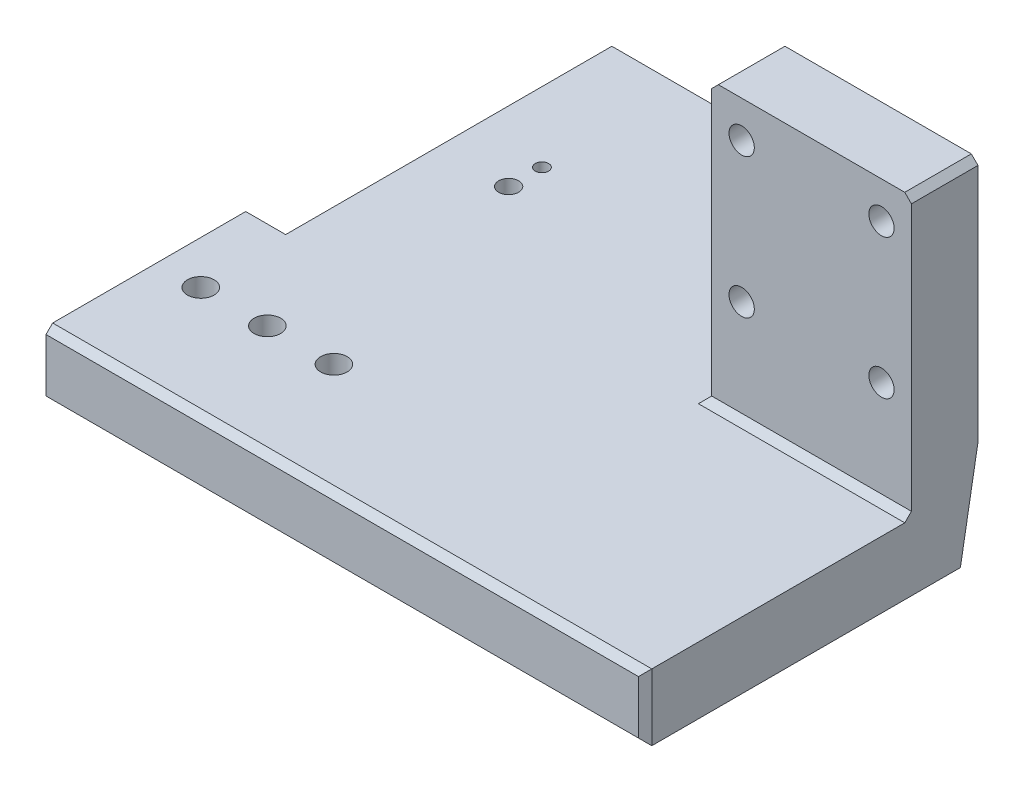
ISO-10303-21;
HEADER;
FILE_DESCRIPTION(('STEP AP214'),'2;1');
FILE_NAME('part.step','',(''),(''),'','','');
FILE_SCHEMA(('AUTOMOTIVE_DESIGN { 1 0 10303 214 1 1 1 1 }'));
ENDSEC;
DATA;
#1=APPLICATION_CONTEXT('core data for automotive mechanical design processes');
#2=APPLICATION_PROTOCOL_DEFINITION('international standard','automotive_design',2000,#1);
#3=PRODUCT_CONTEXT('',#1,'mechanical');
#4=PRODUCT('Part','Part','',(#3));
#5=PRODUCT_RELATED_PRODUCT_CATEGORY('part','',(#4));
#6=PRODUCT_DEFINITION_FORMATION('','',#4);
#7=PRODUCT_DEFINITION_CONTEXT('part definition',#1,'design');
#8=PRODUCT_DEFINITION('design','',#6,#7);
#9=PRODUCT_DEFINITION_SHAPE('','',#8);
#10=(LENGTH_UNIT() NAMED_UNIT(*) SI_UNIT(.MILLI.,.METRE.));
#11=(NAMED_UNIT(*) PLANE_ANGLE_UNIT() SI_UNIT($,.RADIAN.));
#12=(NAMED_UNIT(*) SI_UNIT($,.STERADIAN.) SOLID_ANGLE_UNIT());
#13=UNCERTAINTY_MEASURE_WITH_UNIT(LENGTH_MEASURE(1.E-05),#10,'distance_accuracy_value','');
#14=(GEOMETRIC_REPRESENTATION_CONTEXT(3) GLOBAL_UNCERTAINTY_ASSIGNED_CONTEXT((#13)) GLOBAL_UNIT_ASSIGNED_CONTEXT((#10,
#11,#12)) REPRESENTATION_CONTEXT('',''));
#15=CARTESIAN_POINT('',(0.,0.,0.));
#16=DIRECTION('',(0.,0.,1.));
#17=DIRECTION('',(1.,0.,0.));
#18=AXIS2_PLACEMENT_3D('',#15,#16,#17);
#19=CARTESIAN_POINT('',(0.,0.,10.));
#20=DIRECTION('',(-1.,0.,0.));
#21=DIRECTION('',(0.,-1.,0.));
#22=AXIS2_PLACEMENT_3D('',#19,#20,#21);
#23=PLANE('',#22);
#24=DIRECTION('',(0.,-1.,0.));
#25=VECTOR('',#24,1.);
#26=CARTESIAN_POINT('',(0.,-10.,2.64490471062698));
#27=LINE('',#26,#25);
#28=CARTESIAN_POINT('',(0.,-9.00000000000001,2.64490471062698));
#29=VERTEX_POINT('',#28);
#30=CARTESIAN_POINT('',(0.,-20.,2.64490471062698));
#31=VERTEX_POINT('',#30);
#32=EDGE_CURVE('E280',#29,#31,#27,.T.);
#33=ORIENTED_EDGE('',*,*,#32,.F.);
#34=DIRECTION('',(0.,0.,1.));
#35=VECTOR('',#34,1.);
#36=CARTESIAN_POINT('',(0.,-9.00000000000001,10.));
#37=LINE('',#36,#35);
#38=CARTESIAN_POINT('',(0.,-9.00000000000001,10.));
#39=VERTEX_POINT('',#38);
#40=EDGE_CURVE('E402',#29,#39,#37,.T.);
#41=ORIENTED_EDGE('',*,*,#40,.T.);
#42=DIRECTION('',(0.,1.,0.));
#43=VECTOR('',#42,1.);
#44=CARTESIAN_POINT('',(0.,0.,10.));
#45=LINE('',#44,#43);
#46=CARTESIAN_POINT('',(0.,31.,10.));
#47=VERTEX_POINT('',#46);
#48=EDGE_CURVE('E345',#39,#47,#45,.T.);
#49=ORIENTED_EDGE('',*,*,#48,.T.);
#50=DIRECTION('',(0.,0.,-1.));
#51=VECTOR('',#50,1.);
#52=CARTESIAN_POINT('',(0.,31.,10.));
#53=LINE('',#52,#51);
#54=CARTESIAN_POINT('',(0.,31.,0.));
#55=VERTEX_POINT('',#54);
#56=EDGE_CURVE('E398',#47,#55,#53,.T.);
#57=ORIENTED_EDGE('',*,*,#56,.T.);
#58=DIRECTION('',(0.,1.,0.));
#59=VECTOR('',#58,1.);
#60=CARTESIAN_POINT('',(0.,0.,0.));
#61=LINE('',#60,#59);
#62=CARTESIAN_POINT('',(0.,-4.99999999999969,0.));
#63=VERTEX_POINT('',#62);
#64=EDGE_CURVE('E373',#63,#55,#61,.T.);
#65=ORIENTED_EDGE('',*,*,#64,.F.);
#66=DIRECTION('',(0.,0.984807753012209,-0.173648177666927));
#67=VECTOR('',#66,1.);
#68=CARTESIAN_POINT('',(0.,-1.86086916466353,-0.553513462243659));
#69=LINE('',#68,#67);
#70=EDGE_CURVE('E395',#63,#31,#69,.F.);
#71=ORIENTED_EDGE('',*,*,#70,.T.);
#72=EDGE_LOOP('',(#33,#41,#49,#57,#65,#71));
#73=FACE_BOUND('',#72,.T.);
#74=ADVANCED_FACE('F109',(#73),#23,.T.);
#75=CARTESIAN_POINT('',(0.,0.,10.));
#76=DIRECTION('',(0.,0.,1.));
#77=DIRECTION('',(1.,0.,0.));
#78=AXIS2_PLACEMENT_3D('',#75,#76,#77);
#79=PLANE('',#78);
#80=CARTESIAN_POINT('',(4.5,26.5,10.));
#81=DIRECTION('',(0.,0.,1.));
#82=DIRECTION('',(1.,0.,0.));
#83=AXIS2_PLACEMENT_3D('',#80,#81,#82);
#84=CIRCLE('',#83,1.9);
#85=CARTESIAN_POINT('',(6.4,26.5,10.));
#86=VERTEX_POINT('',#85);
#87=EDGE_CURVE('E328',#86,#86,#84,.T.);
#88=ORIENTED_EDGE('',*,*,#87,.F.);
#89=EDGE_LOOP('',(#88));
#90=FACE_BOUND('',#89,.T.);
#91=CARTESIAN_POINT('',(4.5,5.5,10.));
#92=DIRECTION('',(0.,0.,1.));
#93=DIRECTION('',(1.,0.,0.));
#94=AXIS2_PLACEMENT_3D('',#91,#92,#93);
#95=CIRCLE('',#94,1.9);
#96=CARTESIAN_POINT('',(6.4,5.5,10.));
#97=VERTEX_POINT('',#96);
#98=EDGE_CURVE('E332',#97,#97,#95,.T.);
#99=ORIENTED_EDGE('',*,*,#98,.F.);
#100=EDGE_LOOP('',(#99));
#101=FACE_BOUND('',#100,.T.);
#102=CARTESIAN_POINT('',(25.5,26.5,10.));
#103=DIRECTION('',(0.,0.,1.));
#104=DIRECTION('',(1.,0.,0.));
#105=AXIS2_PLACEMENT_3D('',#102,#103,#104);
#106=CIRCLE('',#105,1.9);
#107=CARTESIAN_POINT('',(27.4,26.5,10.));
#108=VERTEX_POINT('',#107);
#109=EDGE_CURVE('E337',#108,#108,#106,.T.);
#110=ORIENTED_EDGE('',*,*,#109,.F.);
#111=EDGE_LOOP('',(#110));
#112=FACE_BOUND('',#111,.T.);
#113=CARTESIAN_POINT('',(25.5,5.5,10.));
#114=DIRECTION('',(0.,0.,1.));
#115=DIRECTION('',(1.,0.,0.));
#116=AXIS2_PLACEMENT_3D('',#113,#114,#115);
#117=CIRCLE('',#116,1.9);
#118=CARTESIAN_POINT('',(27.4,5.5,10.));
#119=VERTEX_POINT('',#118);
#120=EDGE_CURVE('E341',#119,#119,#117,.T.);
#121=ORIENTED_EDGE('',*,*,#120,.F.);
#122=EDGE_LOOP('',(#121));
#123=FACE_BOUND('',#122,.T.);
#124=ORIENTED_EDGE('',*,*,#48,.F.);
#125=DIRECTION('',(1.,0.,0.));
#126=VECTOR('',#125,1.);
#127=CARTESIAN_POINT('',(0.,-9.00000000000001,10.));
#128=LINE('',#127,#126);
#129=CARTESIAN_POINT('',(30.,-9.00000000000001,10.));
#130=VERTEX_POINT('',#129);
#131=EDGE_CURVE('E428',#39,#130,#128,.T.);
#132=ORIENTED_EDGE('',*,*,#131,.T.);
#133=DIRECTION('',(0.,1.,0.));
#134=VECTOR('',#133,1.);
#135=CARTESIAN_POINT('',(30.,0.,10.));
#136=LINE('',#135,#134);
#137=CARTESIAN_POINT('',(30.,31.,10.));
#138=VERTEX_POINT('',#137);
#139=EDGE_CURVE('E349',#130,#138,#136,.T.);
#140=ORIENTED_EDGE('',*,*,#139,.T.);
#141=DIRECTION('',(-0.707106781186543,0.707106781186552,0.));
#142=VECTOR('',#141,1.);
#143=CARTESIAN_POINT('',(30.5000000000002,30.4999999999998,10.));
#144=LINE('',#143,#142);
#145=CARTESIAN_POINT('',(29.,32.,10.));
#146=VERTEX_POINT('',#145);
#147=EDGE_CURVE('E425',#138,#146,#144,.T.);
#148=ORIENTED_EDGE('',*,*,#147,.T.);
#149=DIRECTION('',(1.,0.,0.));
#150=VECTOR('',#149,1.);
#151=CARTESIAN_POINT('',(0.,32.,10.));
#152=LINE('',#151,#150);
#153=CARTESIAN_POINT('',(0.999999999999994,32.,10.));
#154=VERTEX_POINT('',#153);
#155=EDGE_CURVE('E353',#154,#146,#152,.T.);
#156=ORIENTED_EDGE('',*,*,#155,.F.);
#157=DIRECTION('',(0.707106781186552,0.707106781186543,0.));
#158=VECTOR('',#157,1.);
#159=CARTESIAN_POINT('',(-15.5,15.5000000000002,10.));
#160=LINE('',#159,#158);
#161=EDGE_CURVE('E422',#154,#47,#160,.F.);
#162=ORIENTED_EDGE('',*,*,#161,.T.);
#163=EDGE_LOOP('',(#124,#132,#140,#148,#156,#162));
#164=FACE_BOUND('',#163,.T.);
#165=ADVANCED_FACE('F617',(#90,#101,#112,#123,#164),#79,.T.);
#166=CARTESIAN_POINT('',(0.,-20.,10.));
#167=DIRECTION('',(0.,1.,0.));
#168=DIRECTION('',(0.,0.,1.));
#169=AXIS2_PLACEMENT_3D('',#166,#167,#168);
#170=PLANE('',#169);
#171=CARTESIAN_POINT('',(-53.5,-20.,33.25));
#172=DIRECTION('',(0.,1.,0.));
#173=DIRECTION('',(0.,0.,1.));
#174=AXIS2_PLACEMENT_3D('',#171,#172,#173);
#175=CIRCLE('',#174,2.);
#176=CARTESIAN_POINT('',(-53.5,-20.,35.25));
#177=VERTEX_POINT('',#176);
#178=EDGE_CURVE('E315',#177,#177,#175,.T.);
#179=ORIENTED_EDGE('',*,*,#178,.T.);
#180=EDGE_LOOP('',(#179));
#181=FACE_BOUND('',#180,.T.);
#182=CARTESIAN_POINT('',(-43.5,-20.,33.25));
#183=DIRECTION('',(0.,1.,0.));
#184=DIRECTION('',(0.,0.,1.));
#185=AXIS2_PLACEMENT_3D('',#182,#183,#184);
#186=CIRCLE('',#185,2.);
#187=CARTESIAN_POINT('',(-43.5,-20.,35.25));
#188=VERTEX_POINT('',#187);
#189=EDGE_CURVE('E715',#188,#188,#186,.T.);
#190=ORIENTED_EDGE('',*,*,#189,.T.);
#191=EDGE_LOOP('',(#190));
#192=FACE_BOUND('',#191,.T.);
#193=CARTESIAN_POINT('',(-33.5,-20.,33.25));
#194=DIRECTION('',(0.,1.,0.));
#195=DIRECTION('',(0.,0.,1.));
#196=AXIS2_PLACEMENT_3D('',#193,#194,#195);
#197=CIRCLE('',#196,2.);
#198=CARTESIAN_POINT('',(-33.5,-20.,35.25));
#199=VERTEX_POINT('',#198);
#200=EDGE_CURVE('E719',#199,#199,#197,.T.);
#201=ORIENTED_EDGE('',*,*,#200,.T.);
#202=EDGE_LOOP('',(#201));
#203=FACE_BOUND('',#202,.T.);
#204=CARTESIAN_POINT('',(-43.5,-20.,-8.00000000000001));
#205=DIRECTION('',(0.,1.,0.));
#206=DIRECTION('',(0.,0.,1.));
#207=AXIS2_PLACEMENT_3D('',#204,#205,#206);
#208=CIRCLE('',#207,0.999999999999998);
#209=CARTESIAN_POINT('',(-43.5,-20.,-7.00000000000002));
#210=VERTEX_POINT('',#209);
#211=EDGE_CURVE('E723',#210,#210,#208,.T.);
#212=ORIENTED_EDGE('',*,*,#211,.T.);
#213=EDGE_LOOP('',(#212));
#214=FACE_BOUND('',#213,.T.);
#215=CARTESIAN_POINT('',(-43.5,-20.,-3.00000000000001));
#216=DIRECTION('',(0.,1.,0.));
#217=DIRECTION('',(0.,0.,1.));
#218=AXIS2_PLACEMENT_3D('',#215,#216,#217);
#219=CIRCLE('',#218,1.5);
#220=CARTESIAN_POINT('',(-43.5,-20.,-1.50000000000001));
#221=VERTEX_POINT('',#220);
#222=EDGE_CURVE('E726',#221,#221,#219,.T.);
#223=ORIENTED_EDGE('',*,*,#222,.T.);
#224=EDGE_LOOP('',(#223));
#225=FACE_BOUND('',#224,.T.);
#226=DIRECTION('',(0.,0.,-1.));
#227=VECTOR('',#226,1.);
#228=CARTESIAN_POINT('',(30.,-20.,10.));
#229=LINE('',#228,#227);
#230=CARTESIAN_POINT('',(30.,-20.,49.));
#231=VERTEX_POINT('',#230);
#232=CARTESIAN_POINT('',(30.,-20.,2.64490471062698));
#233=VERTEX_POINT('',#232);
#234=EDGE_CURVE('E357',#231,#233,#229,.T.);
#235=ORIENTED_EDGE('',*,*,#234,.F.);
#236=DIRECTION('',(-1.,0.,0.));
#237=VECTOR('',#236,1.);
#238=CARTESIAN_POINT('',(-60.,-20.,49.));
#239=LINE('',#238,#237);
#240=CARTESIAN_POINT('',(-60.,-20.,49.));
#241=VERTEX_POINT('',#240);
#242=EDGE_CURVE('E455',#231,#241,#239,.T.);
#243=ORIENTED_EDGE('',*,*,#242,.T.);
#244=DIRECTION('',(0.,0.,-1.));
#245=VECTOR('',#244,1.);
#246=CARTESIAN_POINT('',(-60.,-20.,50.));
#247=LINE('',#246,#245);
#248=CARTESIAN_POINT('',(-60.,-20.,20.));
#249=VERTEX_POINT('',#248);
#250=EDGE_CURVE('E307',#241,#249,#247,.T.);
#251=ORIENTED_EDGE('',*,*,#250,.T.);
#252=DIRECTION('',(-1.,0.,0.));
#253=VECTOR('',#252,1.);
#254=CARTESIAN_POINT('',(-55.,-20.,20.));
#255=LINE('',#254,#253);
#256=CARTESIAN_POINT('',(-54.,-20.,20.));
#257=VERTEX_POINT('',#256);
#258=EDGE_CURVE('E311',#257,#249,#255,.T.);
#259=ORIENTED_EDGE('',*,*,#258,.F.);
#260=DIRECTION('',(0.,0.,-1.));
#261=VECTOR('',#260,1.);
#262=CARTESIAN_POINT('',(-54.,-20.,10.));
#263=LINE('',#262,#261);
#264=CARTESIAN_POINT('',(-54.,-20.,-29.));
#265=VERTEX_POINT('',#264);
#266=EDGE_CURVE('E452',#257,#265,#263,.T.);
#267=ORIENTED_EDGE('',*,*,#266,.T.);
#268=DIRECTION('',(1.,0.,0.));
#269=VECTOR('',#268,1.);
#270=CARTESIAN_POINT('',(-5.00000000000001,-20.,-29.));
#271=LINE('',#270,#269);
#272=CARTESIAN_POINT('',(-5.00000000000001,-20.,-29.));
#273=VERTEX_POINT('',#272);
#274=EDGE_CURVE('E291',#265,#273,#271,.T.);
#275=ORIENTED_EDGE('',*,*,#274,.T.);
#276=DIRECTION('',(0.,0.,-1.));
#277=VECTOR('',#276,1.);
#278=CARTESIAN_POINT('',(-5.00000000000001,-20.,0.));
#279=LINE('',#278,#277);
#280=CARTESIAN_POINT('',(-5.00000000000001,-20.,2.64490471062698));
#281=VERTEX_POINT('',#280);
#282=EDGE_CURVE('E266',#281,#273,#279,.T.);
#283=ORIENTED_EDGE('',*,*,#282,.F.);
#284=DIRECTION('',(-1.,0.,0.));
#285=VECTOR('',#284,1.);
#286=CARTESIAN_POINT('',(0.,-20.,2.64490471062698));
#287=LINE('',#286,#285);
#288=EDGE_CURVE('E277',#31,#281,#287,.T.);
#289=ORIENTED_EDGE('',*,*,#288,.F.);
#290=DIRECTION('',(1.,0.,0.));
#291=VECTOR('',#290,1.);
#292=CARTESIAN_POINT('',(0.,-20.,2.64490471062698));
#293=LINE('',#292,#291);
#294=EDGE_CURVE('E386',#31,#233,#293,.T.);
#295=ORIENTED_EDGE('',*,*,#294,.T.);
#296=EDGE_LOOP('',(#235,#243,#251,#259,#267,#275,#283,#289,#295));
#297=FACE_BOUND('',#296,.T.);
#298=ADVANCED_FACE('F289',(#181,#192,#203,#214,#225,#297),#170,.F.);
#299=CARTESIAN_POINT('',(30.,0.,10.));
#300=DIRECTION('',(-1.,0.,0.));
#301=DIRECTION('',(0.,-1.,0.));
#302=AXIS2_PLACEMENT_3D('',#299,#300,#301);
#303=PLANE('',#302);
#304=DIRECTION('',(0.,1.,0.));
#305=VECTOR('',#304,1.);
#306=CARTESIAN_POINT('',(30.,0.,0.));
#307=LINE('',#306,#305);
#308=CARTESIAN_POINT('',(30.,-4.99999999999969,0.));
#309=VERTEX_POINT('',#308);
#310=CARTESIAN_POINT('',(30.,31.,0.));
#311=VERTEX_POINT('',#310);
#312=EDGE_CURVE('E377',#309,#311,#307,.T.);
#313=ORIENTED_EDGE('',*,*,#312,.T.);
#314=DIRECTION('',(0.,0.,1.));
#315=VECTOR('',#314,1.);
#316=CARTESIAN_POINT('',(30.,31.,10.));
#317=LINE('',#316,#315);
#318=EDGE_CURVE('E447',#311,#138,#317,.T.);
#319=ORIENTED_EDGE('',*,*,#318,.T.);
#320=ORIENTED_EDGE('',*,*,#139,.F.);
#321=DIRECTION('',(0.,-0.707106781186543,0.707106781186552));
#322=VECTOR('',#321,1.);
#323=CARTESIAN_POINT('',(30.,-4.50000000000006,5.49999999999999));
#324=LINE('',#323,#322);
#325=CARTESIAN_POINT('',(30.,-10.,11.));
#326=VERTEX_POINT('',#325);
#327=EDGE_CURVE('E500',#130,#326,#324,.T.);
#328=ORIENTED_EDGE('',*,*,#327,.T.);
#329=DIRECTION('',(0.,0.,1.));
#330=VECTOR('',#329,1.);
#331=CARTESIAN_POINT('',(30.,-10.,0.));
#332=LINE('',#331,#330);
#333=CARTESIAN_POINT('',(30.,-10.,49.));
#334=VERTEX_POINT('',#333);
#335=EDGE_CURVE('E274',#326,#334,#332,.T.);
#336=ORIENTED_EDGE('',*,*,#335,.T.);
#337=DIRECTION('',(0.,-1.,0.));
#338=VECTOR('',#337,1.);
#339=CARTESIAN_POINT('',(30.,-20.,49.));
#340=LINE('',#339,#338);
#341=EDGE_CURVE('E444',#334,#231,#340,.T.);
#342=ORIENTED_EDGE('',*,*,#341,.T.);
#343=ORIENTED_EDGE('',*,*,#234,.T.);
#344=DIRECTION('',(0.,-0.984807753012209,0.173648177666927));
#345=VECTOR('',#344,1.);
#346=CARTESIAN_POINT('',(30.,-20.,2.64490471062698));
#347=LINE('',#346,#345);
#348=EDGE_CURVE('E389',#233,#309,#347,.F.);
#349=ORIENTED_EDGE('',*,*,#348,.T.);
#350=EDGE_LOOP('',(#313,#319,#320,#328,#336,#342,#343,#349));
#351=FACE_BOUND('',#350,.T.);
#352=ADVANCED_FACE('F593',(#351),#303,.F.);
#353=CARTESIAN_POINT('',(25.5,5.5,10.));
#354=DIRECTION('',(0.,0.,-1.));
#355=DIRECTION('',(-1.,0.,0.));
#356=AXIS2_PLACEMENT_3D('',#353,#354,#355);
#357=CYLINDRICAL_SURFACE('',#356,1.9);
#358=ORIENTED_EDGE('',*,*,#120,.T.);
#359=EDGE_LOOP('',(#358));
#360=FACE_BOUND('',#359,.T.);
#361=CARTESIAN_POINT('',(25.5,5.5,0.));
#362=DIRECTION('',(0.,0.,1.));
#363=DIRECTION('',(1.,0.,0.));
#364=AXIS2_PLACEMENT_3D('',#361,#362,#363);
#365=CIRCLE('',#364,1.9);
#366=CARTESIAN_POINT('',(27.4,5.5,0.));
#367=VERTEX_POINT('',#366);
#368=EDGE_CURVE('E369',#367,#367,#365,.T.);
#369=ORIENTED_EDGE('',*,*,#368,.F.);
#370=EDGE_LOOP('',(#369));
#371=FACE_BOUND('',#370,.T.);
#372=ADVANCED_FACE('F656',(#360,#371),#357,.F.);
#373=CARTESIAN_POINT('',(25.5,26.5,10.));
#374=DIRECTION('',(0.,0.,-1.));
#375=DIRECTION('',(-1.,0.,0.));
#376=AXIS2_PLACEMENT_3D('',#373,#374,#375);
#377=CYLINDRICAL_SURFACE('',#376,1.9);
#378=ORIENTED_EDGE('',*,*,#109,.T.);
#379=EDGE_LOOP('',(#378));
#380=FACE_BOUND('',#379,.T.);
#381=CARTESIAN_POINT('',(25.5,26.5,0.));
#382=DIRECTION('',(0.,0.,1.));
#383=DIRECTION('',(1.,0.,0.));
#384=AXIS2_PLACEMENT_3D('',#381,#382,#383);
#385=CIRCLE('',#384,1.9);
#386=CARTESIAN_POINT('',(27.4,26.5,0.));
#387=VERTEX_POINT('',#386);
#388=EDGE_CURVE('E365',#387,#387,#385,.T.);
#389=ORIENTED_EDGE('',*,*,#388,.F.);
#390=EDGE_LOOP('',(#389));
#391=FACE_BOUND('',#390,.T.);
#392=ADVANCED_FACE('F659',(#380,#391),#377,.F.);
#393=CARTESIAN_POINT('',(4.5,5.5,10.));
#394=DIRECTION('',(0.,0.,-1.));
#395=DIRECTION('',(-1.,0.,0.));
#396=AXIS2_PLACEMENT_3D('',#393,#394,#395);
#397=CYLINDRICAL_SURFACE('',#396,1.9);
#398=ORIENTED_EDGE('',*,*,#98,.T.);
#399=EDGE_LOOP('',(#398));
#400=FACE_BOUND('',#399,.T.);
#401=CARTESIAN_POINT('',(4.5,5.5,0.));
#402=DIRECTION('',(0.,0.,1.));
#403=DIRECTION('',(1.,0.,0.));
#404=AXIS2_PLACEMENT_3D('',#401,#402,#403);
#405=CIRCLE('',#404,1.9);
#406=CARTESIAN_POINT('',(6.4,5.5,0.));
#407=VERTEX_POINT('',#406);
#408=EDGE_CURVE('E361',#407,#407,#405,.T.);
#409=ORIENTED_EDGE('',*,*,#408,.F.);
#410=EDGE_LOOP('',(#409));
#411=FACE_BOUND('',#410,.T.);
#412=ADVANCED_FACE('F663',(#400,#411),#397,.F.);
#413=CARTESIAN_POINT('',(4.5,26.5,10.));
#414=DIRECTION('',(0.,0.,-1.));
#415=DIRECTION('',(-1.,0.,0.));
#416=AXIS2_PLACEMENT_3D('',#413,#414,#415);
#417=CYLINDRICAL_SURFACE('',#416,1.9);
#418=ORIENTED_EDGE('',*,*,#87,.T.);
#419=EDGE_LOOP('',(#418));
#420=FACE_BOUND('',#419,.T.);
#421=CARTESIAN_POINT('',(4.5,26.5,0.));
#422=DIRECTION('',(0.,0.,1.));
#423=DIRECTION('',(1.,0.,0.));
#424=AXIS2_PLACEMENT_3D('',#421,#422,#423);
#425=CIRCLE('',#424,1.9);
#426=CARTESIAN_POINT('',(6.4,26.5,0.));
#427=VERTEX_POINT('',#426);
#428=EDGE_CURVE('E321',#427,#427,#425,.T.);
#429=ORIENTED_EDGE('',*,*,#428,.F.);
#430=EDGE_LOOP('',(#429));
#431=FACE_BOUND('',#430,.T.);
#432=ADVANCED_FACE('F667',(#420,#431),#417,.F.);
#433=CARTESIAN_POINT('',(0.,32.,10.));
#434=DIRECTION('',(0.,1.,0.));
#435=DIRECTION('',(0.,0.,1.));
#436=AXIS2_PLACEMENT_3D('',#433,#434,#435);
#437=PLANE('',#436);
#438=ORIENTED_EDGE('',*,*,#155,.T.);
#439=DIRECTION('',(0.,0.,-1.));
#440=VECTOR('',#439,1.);
#441=CARTESIAN_POINT('',(29.,32.,0.));
#442=LINE('',#441,#440);
#443=CARTESIAN_POINT('',(29.,32.,0.));
#444=VERTEX_POINT('',#443);
#445=EDGE_CURVE('E434',#146,#444,#442,.T.);
#446=ORIENTED_EDGE('',*,*,#445,.T.);
#447=DIRECTION('',(1.,0.,0.));
#448=VECTOR('',#447,1.);
#449=CARTESIAN_POINT('',(0.,32.,0.));
#450=LINE('',#449,#448);
#451=CARTESIAN_POINT('',(0.999999999999994,32.,0.));
#452=VERTEX_POINT('',#451);
#453=EDGE_CURVE('E333',#452,#444,#450,.T.);
#454=ORIENTED_EDGE('',*,*,#453,.F.);
#455=DIRECTION('',(0.,0.,1.));
#456=VECTOR('',#455,1.);
#457=CARTESIAN_POINT('',(0.999999999999994,32.,10.));
#458=LINE('',#457,#456);
#459=EDGE_CURVE('E431',#452,#154,#458,.T.);
#460=ORIENTED_EDGE('',*,*,#459,.T.);
#461=EDGE_LOOP('',(#438,#446,#454,#460));
#462=FACE_BOUND('',#461,.T.);
#463=ADVANCED_FACE('F611',(#462),#437,.T.);
#464=CARTESIAN_POINT('',(0.,0.,0.));
#465=DIRECTION('',(0.,0.,1.));
#466=DIRECTION('',(1.,0.,0.));
#467=AXIS2_PLACEMENT_3D('',#464,#465,#466);
#468=PLANE('',#467);
#469=ORIENTED_EDGE('',*,*,#428,.T.);
#470=EDGE_LOOP('',(#469));
#471=FACE_BOUND('',#470,.T.);
#472=ORIENTED_EDGE('',*,*,#408,.T.);
#473=EDGE_LOOP('',(#472));
#474=FACE_BOUND('',#473,.T.);
#475=ORIENTED_EDGE('',*,*,#388,.T.);
#476=EDGE_LOOP('',(#475));
#477=FACE_BOUND('',#476,.T.);
#478=ORIENTED_EDGE('',*,*,#368,.T.);
#479=EDGE_LOOP('',(#478));
#480=FACE_BOUND('',#479,.T.);
#481=ORIENTED_EDGE('',*,*,#453,.T.);
#482=DIRECTION('',(0.707106781186543,-0.707106781186552,0.));
#483=VECTOR('',#482,1.);
#484=CARTESIAN_POINT('',(29.,32.,0.));
#485=LINE('',#484,#483);
#486=EDGE_CURVE('E441',#444,#311,#485,.T.);
#487=ORIENTED_EDGE('',*,*,#486,.T.);
#488=ORIENTED_EDGE('',*,*,#312,.F.);
#489=DIRECTION('',(-1.,0.,0.));
#490=VECTOR('',#489,1.);
#491=CARTESIAN_POINT('',(0.,-4.99999999999969,0.));
#492=LINE('',#491,#490);
#493=EDGE_CURVE('E392',#309,#63,#492,.T.);
#494=ORIENTED_EDGE('',*,*,#493,.T.);
#495=ORIENTED_EDGE('',*,*,#64,.T.);
#496=DIRECTION('',(-0.707106781186552,-0.707106781186543,0.));
#497=VECTOR('',#496,1.);
#498=CARTESIAN_POINT('',(0.,31.,0.));
#499=LINE('',#498,#497);
#500=EDGE_CURVE('E438',#55,#452,#499,.F.);
#501=ORIENTED_EDGE('',*,*,#500,.T.);
#502=EDGE_LOOP('',(#481,#487,#488,#494,#495,#501));
#503=FACE_BOUND('',#502,.T.);
#504=ADVANCED_FACE('F603',(#471,#474,#477,#480,#503),#468,.F.);
#505=CARTESIAN_POINT('',(0.,-20.,2.64490471062698));
#506=DIRECTION('',(0.,0.173648177666927,0.984807753012209));
#507=DIRECTION('',(1.,0.,0.));
#508=AXIS2_PLACEMENT_3D('',#505,#506,#507);
#509=PLANE('',#508);
#510=ORIENTED_EDGE('',*,*,#70,.F.);
#511=ORIENTED_EDGE('',*,*,#493,.F.);
#512=ORIENTED_EDGE('',*,*,#348,.F.);
#513=ORIENTED_EDGE('',*,*,#294,.F.);
#514=EDGE_LOOP('',(#510,#511,#512,#513));
#515=FACE_BOUND('',#514,.T.);
#516=ADVANCED_FACE('F598',(#515),#509,.F.);
#517=CARTESIAN_POINT('',(0.,-10.,50.));
#518=DIRECTION('',(0.,0.,1.));
#519=DIRECTION('',(1.,0.,0.));
#520=AXIS2_PLACEMENT_3D('',#517,#518,#519);
#521=PLANE('',#520);
#522=DIRECTION('',(0.,-1.,0.));
#523=VECTOR('',#522,1.);
#524=CARTESIAN_POINT('',(-60.,-10.,50.));
#525=LINE('',#524,#523);
#526=CARTESIAN_POINT('',(-60.,-11.,50.));
#527=VERTEX_POINT('',#526);
#528=CARTESIAN_POINT('',(-60.,-19.,50.));
#529=VERTEX_POINT('',#528);
#530=EDGE_CURVE('E310',#527,#529,#525,.T.);
#531=ORIENTED_EDGE('',*,*,#530,.T.);
#532=DIRECTION('',(1.,0.,0.));
#533=VECTOR('',#532,1.);
#534=CARTESIAN_POINT('',(30.,-19.,50.));
#535=LINE('',#534,#533);
#536=CARTESIAN_POINT('',(29.,-19.,50.));
#537=VERTEX_POINT('',#536);
#538=EDGE_CURVE('E471',#529,#537,#535,.T.);
#539=ORIENTED_EDGE('',*,*,#538,.T.);
#540=DIRECTION('',(0.,1.,0.));
#541=VECTOR('',#540,1.);
#542=CARTESIAN_POINT('',(29.,-10.,50.));
#543=LINE('',#542,#541);
#544=CARTESIAN_POINT('',(29.,-11.,50.));
#545=VERTEX_POINT('',#544);
#546=EDGE_CURVE('E465',#537,#545,#543,.T.);
#547=ORIENTED_EDGE('',*,*,#546,.T.);
#548=DIRECTION('',(-1.,0.,0.));
#549=VECTOR('',#548,1.);
#550=CARTESIAN_POINT('',(-60.,-11.,50.));
#551=LINE('',#550,#549);
#552=EDGE_CURVE('E468',#545,#527,#551,.T.);
#553=ORIENTED_EDGE('',*,*,#552,.T.);
#554=EDGE_LOOP('',(#531,#539,#547,#553));
#555=FACE_BOUND('',#554,.T.);
#556=ADVANCED_FACE('F676',(#555),#521,.T.);
#557=CARTESIAN_POINT('',(-5.00000000000001,-10.,0.));
#558=DIRECTION('',(-1.,0.,0.));
#559=DIRECTION('',(0.,0.,1.));
#560=AXIS2_PLACEMENT_3D('',#557,#558,#559);
#561=PLANE('',#560);
#562=ORIENTED_EDGE('',*,*,#282,.T.);
#563=DIRECTION('',(0.,1.,0.));
#564=VECTOR('',#563,1.);
#565=CARTESIAN_POINT('',(-5.00000000000001,-10.,-29.));
#566=LINE('',#565,#564);
#567=CARTESIAN_POINT('',(-5.00000000000001,-10.,-29.));
#568=VERTEX_POINT('',#567);
#569=EDGE_CURVE('E494',#273,#568,#566,.T.);
#570=ORIENTED_EDGE('',*,*,#569,.T.);
#571=DIRECTION('',(0.,0.,-1.));
#572=VECTOR('',#571,1.);
#573=CARTESIAN_POINT('',(-5.00000000000001,-10.,0.));
#574=LINE('',#573,#572);
#575=CARTESIAN_POINT('',(-5.00000000000001,-10.,2.64490471062698));
#576=VERTEX_POINT('',#575);
#577=EDGE_CURVE('E269',#576,#568,#574,.T.);
#578=ORIENTED_EDGE('',*,*,#577,.F.);
#579=DIRECTION('',(0.,-1.,0.));
#580=VECTOR('',#579,1.);
#581=CARTESIAN_POINT('',(-5.,-10.,2.64490471062698));
#582=LINE('',#581,#580);
#583=EDGE_CURVE('E262',#576,#281,#582,.T.);
#584=ORIENTED_EDGE('',*,*,#583,.T.);
#585=EDGE_LOOP('',(#562,#570,#578,#584));
#586=FACE_BOUND('',#585,.T.);
#587=ADVANCED_FACE('F264',(#586),#561,.F.);
#588=CARTESIAN_POINT('',(0.,-10.,-30.));
#589=DIRECTION('',(0.,0.,-1.));
#590=DIRECTION('',(-1.,0.,0.));
#591=AXIS2_PLACEMENT_3D('',#588,#589,#590);
#592=PLANE('',#591);
#593=DIRECTION('',(0.,-1.,0.));
#594=VECTOR('',#593,1.);
#595=CARTESIAN_POINT('',(-6.00000000000001,-20.,-30.));
#596=LINE('',#595,#594);
#597=CARTESIAN_POINT('',(-6.00000000000001,-11.,-30.));
#598=VERTEX_POINT('',#597);
#599=CARTESIAN_POINT('',(-6.00000000000001,-19.,-30.));
#600=VERTEX_POINT('',#599);
#601=EDGE_CURVE('E128',#598,#600,#596,.T.);
#602=ORIENTED_EDGE('',*,*,#601,.T.);
#603=DIRECTION('',(-1.,0.,0.));
#604=VECTOR('',#603,1.);
#605=CARTESIAN_POINT('',(-55.,-19.,-30.));
#606=LINE('',#605,#604);
#607=CARTESIAN_POINT('',(-54.,-19.,-30.));
#608=VERTEX_POINT('',#607);
#609=EDGE_CURVE('E491',#600,#608,#606,.T.);
#610=ORIENTED_EDGE('',*,*,#609,.T.);
#611=DIRECTION('',(0.,1.,0.));
#612=VECTOR('',#611,1.);
#613=CARTESIAN_POINT('',(-54.,-10.,-30.));
#614=LINE('',#613,#612);
#615=CARTESIAN_POINT('',(-54.,-11.,-30.));
#616=VERTEX_POINT('',#615);
#617=EDGE_CURVE('E484',#608,#616,#614,.T.);
#618=ORIENTED_EDGE('',*,*,#617,.T.);
#619=DIRECTION('',(1.,0.,0.));
#620=VECTOR('',#619,1.);
#621=CARTESIAN_POINT('',(-5.00000000000001,-11.,-30.));
#622=LINE('',#621,#620);
#623=EDGE_CURVE('E133',#616,#598,#622,.T.);
#624=ORIENTED_EDGE('',*,*,#623,.T.);
#625=EDGE_LOOP('',(#602,#610,#618,#624));
#626=FACE_BOUND('',#625,.T.);
#627=ADVANCED_FACE('F780',(#626),#592,.T.);
#628=CARTESIAN_POINT('',(-55.,-10.,0.));
#629=DIRECTION('',(1.,0.,0.));
#630=DIRECTION('',(0.,0.,-1.));
#631=AXIS2_PLACEMENT_3D('',#628,#629,#630);
#632=PLANE('',#631);
#633=DIRECTION('',(0.,-1.,0.));
#634=VECTOR('',#633,1.);
#635=CARTESIAN_POINT('',(-55.,-20.,-29.));
#636=LINE('',#635,#634);
#637=CARTESIAN_POINT('',(-55.,-11.,-29.));
#638=VERTEX_POINT('',#637);
#639=CARTESIAN_POINT('',(-55.,-19.,-29.));
#640=VERTEX_POINT('',#639);
#641=EDGE_CURVE('E474',#638,#640,#636,.T.);
#642=ORIENTED_EDGE('',*,*,#641,.T.);
#643=DIRECTION('',(0.,0.,1.));
#644=VECTOR('',#643,1.);
#645=CARTESIAN_POINT('',(-55.,-19.,0.));
#646=LINE('',#645,#644);
#647=CARTESIAN_POINT('',(-55.,-19.,20.));
#648=VERTEX_POINT('',#647);
#649=EDGE_CURVE('E480',#640,#648,#646,.T.);
#650=ORIENTED_EDGE('',*,*,#649,.T.);
#651=DIRECTION('',(0.,-1.,0.));
#652=VECTOR('',#651,1.);
#653=CARTESIAN_POINT('',(-55.,-10.,20.));
#654=LINE('',#653,#652);
#655=CARTESIAN_POINT('',(-55.,-11.,20.));
#656=VERTEX_POINT('',#655);
#657=EDGE_CURVE('E273',#656,#648,#654,.T.);
#658=ORIENTED_EDGE('',*,*,#657,.F.);
#659=DIRECTION('',(0.,0.,-1.));
#660=VECTOR('',#659,1.);
#661=CARTESIAN_POINT('',(-55.,-11.,0.));
#662=LINE('',#661,#660);
#663=EDGE_CURVE('E477',#656,#638,#662,.T.);
#664=ORIENTED_EDGE('',*,*,#663,.T.);
#665=EDGE_LOOP('',(#642,#650,#658,#664));
#666=FACE_BOUND('',#665,.T.);
#667=ADVANCED_FACE('F565',(#666),#632,.F.);
#668=CARTESIAN_POINT('',(0.,-10.,0.));
#669=DIRECTION('',(0.,-1.,0.));
#670=DIRECTION('',(0.,0.,-1.));
#671=AXIS2_PLACEMENT_3D('',#668,#669,#670);
#672=PLANE('',#671);
#673=CARTESIAN_POINT('',(-53.5,-10.,33.25));
#674=DIRECTION('',(0.,1.,0.));
#675=DIRECTION('',(0.,0.,1.));
#676=AXIS2_PLACEMENT_3D('',#673,#674,#675);
#677=CIRCLE('',#676,2.);
#678=CARTESIAN_POINT('',(-53.5,-10.,35.25));
#679=VERTEX_POINT('',#678);
#680=EDGE_CURVE('E729',#679,#679,#677,.T.);
#681=ORIENTED_EDGE('',*,*,#680,.F.);
#682=EDGE_LOOP('',(#681));
#683=FACE_BOUND('',#682,.T.);
#684=CARTESIAN_POINT('',(-43.5,-10.,33.25));
#685=DIRECTION('',(0.,1.,0.));
#686=DIRECTION('',(0.,0.,1.));
#687=AXIS2_PLACEMENT_3D('',#684,#685,#686);
#688=CIRCLE('',#687,2.);
#689=CARTESIAN_POINT('',(-43.5,-10.,35.25));
#690=VERTEX_POINT('',#689);
#691=EDGE_CURVE('E735',#690,#690,#688,.T.);
#692=ORIENTED_EDGE('',*,*,#691,.F.);
#693=EDGE_LOOP('',(#692));
#694=FACE_BOUND('',#693,.T.);
#695=CARTESIAN_POINT('',(-33.5,-10.,33.25));
#696=DIRECTION('',(0.,1.,0.));
#697=DIRECTION('',(0.,0.,1.));
#698=AXIS2_PLACEMENT_3D('',#695,#696,#697);
#699=CIRCLE('',#698,2.);
#700=CARTESIAN_POINT('',(-33.5,-10.,35.25));
#701=VERTEX_POINT('',#700);
#702=EDGE_CURVE('E751',#701,#701,#699,.T.);
#703=ORIENTED_EDGE('',*,*,#702,.F.);
#704=EDGE_LOOP('',(#703));
#705=FACE_BOUND('',#704,.T.);
#706=CARTESIAN_POINT('',(-43.5,-10.,-8.00000000000001));
#707=DIRECTION('',(0.,1.,0.));
#708=DIRECTION('',(0.,0.,1.));
#709=AXIS2_PLACEMENT_3D('',#706,#707,#708);
#710=CIRCLE('',#709,0.999999999999998);
#711=CARTESIAN_POINT('',(-43.5,-10.,-7.00000000000002));
#712=VERTEX_POINT('',#711);
#713=EDGE_CURVE('E747',#712,#712,#710,.T.);
#714=ORIENTED_EDGE('',*,*,#713,.F.);
#715=EDGE_LOOP('',(#714));
#716=FACE_BOUND('',#715,.T.);
#717=CARTESIAN_POINT('',(-43.5,-10.,-3.00000000000001));
#718=DIRECTION('',(0.,1.,0.));
#719=DIRECTION('',(0.,0.,1.));
#720=AXIS2_PLACEMENT_3D('',#717,#718,#719);
#721=CIRCLE('',#720,1.5);
#722=CARTESIAN_POINT('',(-43.5,-10.,-1.50000000000001));
#723=VERTEX_POINT('',#722);
#724=EDGE_CURVE('E509',#723,#723,#721,.T.);
#725=ORIENTED_EDGE('',*,*,#724,.F.);
#726=EDGE_LOOP('',(#725));
#727=FACE_BOUND('',#726,.T.);
#728=DIRECTION('',(-1.,0.,0.));
#729=VECTOR('',#728,1.);
#730=CARTESIAN_POINT('',(0.,-10.,11.));
#731=LINE('',#730,#729);
#732=CARTESIAN_POINT('',(-0.999999999999999,-10.,11.));
#733=VERTEX_POINT('',#732);
#734=EDGE_CURVE('E416',#326,#733,#731,.T.);
#735=ORIENTED_EDGE('',*,*,#734,.T.);
#736=DIRECTION('',(0.,0.,-1.));
#737=VECTOR('',#736,1.);
#738=CARTESIAN_POINT('',(-0.999999999999999,-10.,0.));
#739=LINE('',#738,#737);
#740=CARTESIAN_POINT('',(-0.999999999999999,-10.,2.64490471062698));
#741=VERTEX_POINT('',#740);
#742=EDGE_CURVE('E419',#733,#741,#739,.T.);
#743=ORIENTED_EDGE('',*,*,#742,.T.);
#744=DIRECTION('',(-1.,0.,0.));
#745=VECTOR('',#744,1.);
#746=CARTESIAN_POINT('',(0.,-10.,2.64490471062698));
#747=LINE('',#746,#745);
#748=EDGE_CURVE('E285',#741,#576,#747,.T.);
#749=ORIENTED_EDGE('',*,*,#748,.T.);
#750=ORIENTED_EDGE('',*,*,#577,.T.);
#751=DIRECTION('',(-1.,0.,0.));
#752=VECTOR('',#751,1.);
#753=CARTESIAN_POINT('',(-55.,-10.,-29.));
#754=LINE('',#753,#752);
#755=CARTESIAN_POINT('',(-54.,-10.,-29.));
#756=VERTEX_POINT('',#755);
#757=EDGE_CURVE('E406',#568,#756,#754,.T.);
#758=ORIENTED_EDGE('',*,*,#757,.T.);
#759=DIRECTION('',(0.,0.,1.));
#760=VECTOR('',#759,1.);
#761=CARTESIAN_POINT('',(-54.,-10.,0.));
#762=LINE('',#761,#760);
#763=CARTESIAN_POINT('',(-54.,-10.,20.));
#764=VERTEX_POINT('',#763);
#765=EDGE_CURVE('E409',#756,#764,#762,.T.);
#766=ORIENTED_EDGE('',*,*,#765,.T.);
#767=DIRECTION('',(-1.,0.,0.));
#768=VECTOR('',#767,1.);
#769=CARTESIAN_POINT('',(-55.,-10.,20.));
#770=LINE('',#769,#768);
#771=CARTESIAN_POINT('',(-60.,-10.,20.));
#772=VERTEX_POINT('',#771);
#773=EDGE_CURVE('E302',#764,#772,#770,.T.);
#774=ORIENTED_EDGE('',*,*,#773,.T.);
#775=DIRECTION('',(0.,0.,-1.));
#776=VECTOR('',#775,1.);
#777=CARTESIAN_POINT('',(-60.,-10.,50.));
#778=LINE('',#777,#776);
#779=CARTESIAN_POINT('',(-60.,-10.,49.));
#780=VERTEX_POINT('',#779);
#781=EDGE_CURVE('E306',#780,#772,#778,.T.);
#782=ORIENTED_EDGE('',*,*,#781,.F.);
#783=DIRECTION('',(1.,0.,0.));
#784=VECTOR('',#783,1.);
#785=CARTESIAN_POINT('',(30.,-10.,49.));
#786=LINE('',#785,#784);
#787=EDGE_CURVE('E413',#780,#334,#786,.T.);
#788=ORIENTED_EDGE('',*,*,#787,.T.);
#789=ORIENTED_EDGE('',*,*,#335,.F.);
#790=EDGE_LOOP('',(#735,#743,#749,#750,#758,#766,#774,#782,#788,#789));
#791=FACE_BOUND('',#790,.T.);
#792=ADVANCED_FACE('F554',(#683,#694,#705,#716,#727,#791),#672,.F.);
#793=CARTESIAN_POINT('',(0.,-10.,2.64490471062698));
#794=DIRECTION('',(0.,0.,1.));
#795=DIRECTION('',(1.,0.,0.));
#796=AXIS2_PLACEMENT_3D('',#793,#794,#795);
#797=PLANE('',#796);
#798=ORIENTED_EDGE('',*,*,#288,.T.);
#799=ORIENTED_EDGE('',*,*,#583,.F.);
#800=ORIENTED_EDGE('',*,*,#748,.F.);
#801=DIRECTION('',(0.707106781186552,0.707106781186543,0.));
#802=VECTOR('',#801,1.);
#803=CARTESIAN_POINT('',(-0.499999999999991,-9.5,2.64490471062698));
#804=LINE('',#803,#802);
#805=EDGE_CURVE('E497',#741,#29,#804,.T.);
#806=ORIENTED_EDGE('',*,*,#805,.T.);
#807=ORIENTED_EDGE('',*,*,#32,.T.);
#808=EDGE_LOOP('',(#798,#799,#800,#806,#807));
#809=FACE_BOUND('',#808,.T.);
#810=ADVANCED_FACE('F278',(#809),#797,.F.);
#811=CARTESIAN_POINT('',(-60.,-10.,50.));
#812=DIRECTION('',(-1.,0.,0.));
#813=DIRECTION('',(0.,0.,1.));
#814=AXIS2_PLACEMENT_3D('',#811,#812,#813);
#815=PLANE('',#814);
#816=ORIENTED_EDGE('',*,*,#250,.F.);
#817=DIRECTION('',(0.,0.707106781186552,0.707106781186543));
#818=VECTOR('',#817,1.);
#819=CARTESIAN_POINT('',(-60.,-14.4999999999999,54.5));
#820=LINE('',#819,#818);
#821=EDGE_CURVE('E462',#241,#529,#820,.T.);
#822=ORIENTED_EDGE('',*,*,#821,.T.);
#823=ORIENTED_EDGE('',*,*,#530,.F.);
#824=DIRECTION('',(0.,0.707106781186552,-0.707106781186543));
#825=VECTOR('',#824,1.);
#826=CARTESIAN_POINT('',(-60.,-10.5,49.5));
#827=LINE('',#826,#825);
#828=EDGE_CURVE('E459',#527,#780,#827,.T.);
#829=ORIENTED_EDGE('',*,*,#828,.T.);
#830=ORIENTED_EDGE('',*,*,#781,.T.);
#831=DIRECTION('',(0.,-1.,0.));
#832=VECTOR('',#831,1.);
#833=CARTESIAN_POINT('',(-60.,-10.,20.));
#834=LINE('',#833,#832);
#835=EDGE_CURVE('E286',#772,#249,#834,.T.);
#836=ORIENTED_EDGE('',*,*,#835,.T.);
#837=EDGE_LOOP('',(#816,#822,#823,#829,#830,#836));
#838=FACE_BOUND('',#837,.T.);
#839=ADVANCED_FACE('F576',(#838),#815,.T.);
#840=CARTESIAN_POINT('',(-55.,-10.,20.));
#841=DIRECTION('',(0.,0.,1.));
#842=DIRECTION('',(1.,0.,0.));
#843=AXIS2_PLACEMENT_3D('',#840,#841,#842);
#844=PLANE('',#843);
#845=ORIENTED_EDGE('',*,*,#258,.T.);
#846=ORIENTED_EDGE('',*,*,#835,.F.);
#847=ORIENTED_EDGE('',*,*,#773,.F.);
#848=DIRECTION('',(0.707106781186552,0.707106781186543,0.));
#849=VECTOR('',#848,1.);
#850=CARTESIAN_POINT('',(-54.5,-10.5,20.));
#851=LINE('',#850,#849);
#852=EDGE_CURVE('E12',#764,#656,#851,.F.);
#853=ORIENTED_EDGE('',*,*,#852,.T.);
#854=ORIENTED_EDGE('',*,*,#657,.T.);
#855=DIRECTION('',(-0.707106781186552,0.707106781186543,0.));
#856=VECTOR('',#855,1.);
#857=CARTESIAN_POINT('',(-59.5,-14.5000000000001,20.));
#858=LINE('',#857,#856);
#859=EDGE_CURVE('E120',#648,#257,#858,.F.);
#860=ORIENTED_EDGE('',*,*,#859,.T.);
#861=EDGE_LOOP('',(#845,#846,#847,#853,#854,#860));
#862=FACE_BOUND('',#861,.T.);
#863=ADVANCED_FACE('F562',(#862),#844,.F.);
#864=CARTESIAN_POINT('',(-43.5,-45.,-3.00000000000001));
#865=DIRECTION('',(0.,1.,0.));
#866=DIRECTION('',(0.,0.,1.));
#867=AXIS2_PLACEMENT_3D('',#864,#865,#866);
#868=CYLINDRICAL_SURFACE('',#867,1.5);
#869=ORIENTED_EDGE('',*,*,#724,.T.);
#870=EDGE_LOOP('',(#869));
#871=FACE_BOUND('',#870,.T.);
#872=ORIENTED_EDGE('',*,*,#222,.F.);
#873=EDGE_LOOP('',(#872));
#874=FACE_BOUND('',#873,.T.);
#875=ADVANCED_FACE('F693',(#871,#874),#868,.F.);
#876=CARTESIAN_POINT('',(-43.5,-45.,-8.00000000000001));
#877=DIRECTION('',(0.,1.,0.));
#878=DIRECTION('',(0.,0.,1.));
#879=AXIS2_PLACEMENT_3D('',#876,#877,#878);
#880=CYLINDRICAL_SURFACE('',#879,0.999999999999998);
#881=ORIENTED_EDGE('',*,*,#713,.T.);
#882=EDGE_LOOP('',(#881));
#883=FACE_BOUND('',#882,.T.);
#884=ORIENTED_EDGE('',*,*,#211,.F.);
#885=EDGE_LOOP('',(#884));
#886=FACE_BOUND('',#885,.T.);
#887=ADVANCED_FACE('F769',(#883,#886),#880,.F.);
#888=CARTESIAN_POINT('',(-33.5,-45.,33.25));
#889=DIRECTION('',(0.,1.,0.));
#890=DIRECTION('',(0.,0.,1.));
#891=AXIS2_PLACEMENT_3D('',#888,#889,#890);
#892=CYLINDRICAL_SURFACE('',#891,2.);
#893=ORIENTED_EDGE('',*,*,#702,.T.);
#894=EDGE_LOOP('',(#893));
#895=FACE_BOUND('',#894,.T.);
#896=ORIENTED_EDGE('',*,*,#200,.F.);
#897=EDGE_LOOP('',(#896));
#898=FACE_BOUND('',#897,.T.);
#899=ADVANCED_FACE('F774',(#895,#898),#892,.F.);
#900=CARTESIAN_POINT('',(-43.5,-45.,33.25));
#901=DIRECTION('',(0.,1.,0.));
#902=DIRECTION('',(0.,0.,1.));
#903=AXIS2_PLACEMENT_3D('',#900,#901,#902);
#904=CYLINDRICAL_SURFACE('',#903,2.);
#905=ORIENTED_EDGE('',*,*,#691,.T.);
#906=EDGE_LOOP('',(#905));
#907=FACE_BOUND('',#906,.T.);
#908=ORIENTED_EDGE('',*,*,#189,.F.);
#909=EDGE_LOOP('',(#908));
#910=FACE_BOUND('',#909,.T.);
#911=ADVANCED_FACE('F759',(#907,#910),#904,.F.);
#912=CARTESIAN_POINT('',(-53.5,-45.,33.25));
#913=DIRECTION('',(0.,1.,0.));
#914=DIRECTION('',(0.,0.,1.));
#915=AXIS2_PLACEMENT_3D('',#912,#913,#914);
#916=CYLINDRICAL_SURFACE('',#915,2.);
#917=ORIENTED_EDGE('',*,*,#680,.T.);
#918=EDGE_LOOP('',(#917));
#919=FACE_BOUND('',#918,.T.);
#920=ORIENTED_EDGE('',*,*,#178,.F.);
#921=EDGE_LOOP('',(#920));
#922=FACE_BOUND('',#921,.T.);
#923=ADVANCED_FACE('F641',(#919,#922),#916,.F.);
#924=CARTESIAN_POINT('',(0.,-10.,11.));
#925=DIRECTION('',(0.,-0.707106781186552,-0.707106781186543));
#926=DIRECTION('',(-1.,0.,0.));
#927=AXIS2_PLACEMENT_3D('',#924,#925,#926);
#928=PLANE('',#927);
#929=ORIENTED_EDGE('',*,*,#327,.F.);
#930=ORIENTED_EDGE('',*,*,#131,.F.);
#931=DIRECTION('',(-0.577350269189628,-0.57735026918962,0.577350269189628));
#932=VECTOR('',#931,1.);
#933=CARTESIAN_POINT('',(-0.666666666666663,-9.66666666666667,10.6666666666667));
#934=LINE('',#933,#932);
#935=EDGE_CURVE('E506',#733,#39,#934,.F.);
#936=ORIENTED_EDGE('',*,*,#935,.F.);
#937=ORIENTED_EDGE('',*,*,#734,.F.);
#938=EDGE_LOOP('',(#929,#930,#936,#937));
#939=FACE_BOUND('',#938,.T.);
#940=ADVANCED_FACE('F629',(#939),#928,.F.);
#941=CARTESIAN_POINT('',(0.,-9.00000000000001,10.));
#942=DIRECTION('',(0.707106781186543,-0.707106781186552,0.));
#943=DIRECTION('',(0.,0.,1.));
#944=AXIS2_PLACEMENT_3D('',#941,#942,#943);
#945=PLANE('',#944);
#946=ORIENTED_EDGE('',*,*,#805,.F.);
#947=ORIENTED_EDGE('',*,*,#742,.F.);
#948=ORIENTED_EDGE('',*,*,#935,.T.);
#949=ORIENTED_EDGE('',*,*,#40,.F.);
#950=EDGE_LOOP('',(#946,#947,#948,#949));
#951=FACE_BOUND('',#950,.T.);
#952=ADVANCED_FACE('F633',(#951),#945,.F.);
#953=CARTESIAN_POINT('',(29.,32.,10.));
#954=DIRECTION('',(0.707106781186552,0.707106781186543,0.));
#955=DIRECTION('',(0.,0.,1.));
#956=AXIS2_PLACEMENT_3D('',#953,#954,#955);
#957=PLANE('',#956);
#958=ORIENTED_EDGE('',*,*,#147,.F.);
#959=ORIENTED_EDGE('',*,*,#318,.F.);
#960=ORIENTED_EDGE('',*,*,#486,.F.);
#961=ORIENTED_EDGE('',*,*,#445,.F.);
#962=EDGE_LOOP('',(#958,#959,#960,#961));
#963=FACE_BOUND('',#962,.T.);
#964=ADVANCED_FACE('F609',(#963),#957,.T.);
#965=CARTESIAN_POINT('',(0.,31.,10.));
#966=DIRECTION('',(0.707106781186543,-0.707106781186552,0.));
#967=DIRECTION('',(0.,0.,-1.));
#968=AXIS2_PLACEMENT_3D('',#965,#966,#967);
#969=PLANE('',#968);
#970=ORIENTED_EDGE('',*,*,#161,.F.);
#971=ORIENTED_EDGE('',*,*,#459,.F.);
#972=ORIENTED_EDGE('',*,*,#500,.F.);
#973=ORIENTED_EDGE('',*,*,#56,.F.);
#974=EDGE_LOOP('',(#970,#971,#972,#973));
#975=FACE_BOUND('',#974,.T.);
#976=ADVANCED_FACE('F620',(#975),#969,.F.);
#977=CARTESIAN_POINT('',(0.,-11.,50.));
#978=DIRECTION('',(0.,0.707106781186542,0.707106781186552));
#979=DIRECTION('',(1.,0.,0.));
#980=AXIS2_PLACEMENT_3D('',#977,#978,#979);
#981=PLANE('',#980);
#982=ORIENTED_EDGE('',*,*,#828,.F.);
#983=ORIENTED_EDGE('',*,*,#552,.F.);
#984=DIRECTION('',(-0.577350269189628,-0.577350269189629,0.577350269189621));
#985=VECTOR('',#984,1.);
#986=CARTESIAN_POINT('',(33.3333333333334,-6.66666666666663,45.6666666666667));
#987=LINE('',#986,#985);
#988=EDGE_CURVE('E510',#334,#545,#987,.T.);
#989=ORIENTED_EDGE('',*,*,#988,.F.);
#990=ORIENTED_EDGE('',*,*,#787,.F.);
#991=EDGE_LOOP('',(#982,#983,#989,#990));
#992=FACE_BOUND('',#991,.T.);
#993=ADVANCED_FACE('F585',(#992),#981,.T.);
#994=CARTESIAN_POINT('',(30.,0.,49.));
#995=DIRECTION('',(0.707106781186543,0.,0.707106781186552));
#996=DIRECTION('',(0.,1.,0.));
#997=AXIS2_PLACEMENT_3D('',#994,#995,#996);
#998=PLANE('',#997);
#999=ORIENTED_EDGE('',*,*,#988,.T.);
#1000=ORIENTED_EDGE('',*,*,#546,.F.);
#1001=DIRECTION('',(0.577350269189628,-0.577350269189629,-0.577350269189621));
#1002=VECTOR('',#1001,1.);
#1003=CARTESIAN_POINT('',(23.3333333333333,-13.3333333333333,55.6666666666667));
#1004=LINE('',#1003,#1002);
#1005=EDGE_CURVE('E511',#231,#537,#1004,.F.);
#1006=ORIENTED_EDGE('',*,*,#1005,.F.);
#1007=ORIENTED_EDGE('',*,*,#341,.F.);
#1008=EDGE_LOOP('',(#999,#1000,#1006,#1007));
#1009=FACE_BOUND('',#1008,.T.);
#1010=ADVANCED_FACE('F591',(#1009),#998,.T.);
#1011=CARTESIAN_POINT('',(0.,-20.,49.));
#1012=DIRECTION('',(0.,-0.707106781186542,0.707106781186552));
#1013=DIRECTION('',(1.,0.,0.));
#1014=AXIS2_PLACEMENT_3D('',#1011,#1012,#1013);
#1015=PLANE('',#1014);
#1016=ORIENTED_EDGE('',*,*,#1005,.T.);
#1017=ORIENTED_EDGE('',*,*,#538,.F.);
#1018=ORIENTED_EDGE('',*,*,#821,.F.);
#1019=ORIENTED_EDGE('',*,*,#242,.F.);
#1020=EDGE_LOOP('',(#1016,#1017,#1018,#1019));
#1021=FACE_BOUND('',#1020,.T.);
#1022=ADVANCED_FACE('F888',(#1021),#1015,.T.);
#1023=CARTESIAN_POINT('',(0.,-11.,-30.));
#1024=DIRECTION('',(0.,0.707106781186543,-0.707106781186552));
#1025=DIRECTION('',(-1.,0.,0.));
#1026=AXIS2_PLACEMENT_3D('',#1023,#1024,#1025);
#1027=PLANE('',#1026);
#1028=DIRECTION('',(0.,-0.707106781186552,-0.707106781186543));
#1029=VECTOR('',#1028,1.);
#1030=CARTESIAN_POINT('',(-54.,-10.5,-29.5));
#1031=LINE('',#1030,#1029);
#1032=EDGE_CURVE('E540',#756,#616,#1031,.T.);
#1033=ORIENTED_EDGE('',*,*,#1032,.F.);
#1034=ORIENTED_EDGE('',*,*,#757,.F.);
#1035=DIRECTION('',(-0.577350269189628,-0.577350269189628,-0.57735026918962));
#1036=VECTOR('',#1035,1.);
#1037=CARTESIAN_POINT('',(-3.99999999999999,-8.99999999999998,-28.));
#1038=LINE('',#1037,#1036);
#1039=EDGE_CURVE('E114',#598,#568,#1038,.F.);
#1040=ORIENTED_EDGE('',*,*,#1039,.F.);
#1041=ORIENTED_EDGE('',*,*,#623,.F.);
#1042=EDGE_LOOP('',(#1033,#1034,#1040,#1041));
#1043=FACE_BOUND('',#1042,.T.);
#1044=ADVANCED_FACE('F112',(#1043),#1027,.T.);
#1045=CARTESIAN_POINT('',(-54.,-10.,0.));
#1046=DIRECTION('',(0.707106781186543,-0.707106781186552,0.));
#1047=DIRECTION('',(0.,0.,1.));
#1048=AXIS2_PLACEMENT_3D('',#1045,#1046,#1047);
#1049=PLANE('',#1048);
#1050=ORIENTED_EDGE('',*,*,#852,.F.);
#1051=ORIENTED_EDGE('',*,*,#765,.F.);
#1052=DIRECTION('',(-0.707106781186552,-0.707106781186543,0.));
#1053=VECTOR('',#1052,1.);
#1054=CARTESIAN_POINT('',(-55.,-11.,-29.));
#1055=LINE('',#1054,#1053);
#1056=EDGE_CURVE('E537',#638,#756,#1055,.F.);
#1057=ORIENTED_EDGE('',*,*,#1056,.F.);
#1058=ORIENTED_EDGE('',*,*,#663,.F.);
#1059=EDGE_LOOP('',(#1050,#1051,#1057,#1058));
#1060=FACE_BOUND('',#1059,.T.);
#1061=ADVANCED_FACE('F558',(#1060),#1049,.F.);
#1062=CARTESIAN_POINT('',(-6.00000000000001,-10.,-30.));
#1063=DIRECTION('',(0.707106781186543,0.,-0.707106781186552));
#1064=DIRECTION('',(0.,1.,0.));
#1065=AXIS2_PLACEMENT_3D('',#1062,#1063,#1064);
#1066=PLANE('',#1065);
#1067=ORIENTED_EDGE('',*,*,#1039,.T.);
#1068=ORIENTED_EDGE('',*,*,#569,.F.);
#1069=DIRECTION('',(-0.577350269189628,0.577350269189628,-0.57735026918962));
#1070=VECTOR('',#1069,1.);
#1071=CARTESIAN_POINT('',(-9.00000000000004,-16.,-33.));
#1072=LINE('',#1071,#1070);
#1073=EDGE_CURVE('E533',#600,#273,#1072,.F.);
#1074=ORIENTED_EDGE('',*,*,#1073,.F.);
#1075=ORIENTED_EDGE('',*,*,#601,.F.);
#1076=EDGE_LOOP('',(#1067,#1068,#1074,#1075));
#1077=FACE_BOUND('',#1076,.T.);
#1078=ADVANCED_FACE('F549',(#1077),#1066,.T.);
#1079=CARTESIAN_POINT('',(-55.,-11.,-29.));
#1080=DIRECTION('',(-0.577350269189618,0.577350269189626,-0.577350269189634));
#1081=DIRECTION('',(0.,0.707106781186552,0.707106781186543));
#1082=AXIS2_PLACEMENT_3D('',#1079,#1080,#1081);
#1083=PLANE('',#1082);
#1084=ORIENTED_EDGE('',*,*,#1056,.T.);
#1085=ORIENTED_EDGE('',*,*,#1032,.T.);
#1086=DIRECTION('',(-0.707106781186552,0.,0.707106781186543));
#1087=VECTOR('',#1086,1.);
#1088=CARTESIAN_POINT('',(-55.,-11.,-29.));
#1089=LINE('',#1088,#1087);
#1090=EDGE_CURVE('E529',#638,#616,#1089,.F.);
#1091=ORIENTED_EDGE('',*,*,#1090,.F.);
#1092=EDGE_LOOP('',(#1084,#1085,#1091));
#1093=FACE_BOUND('',#1092,.T.);
#1094=ADVANCED_FACE('F920',(#1093),#1083,.T.);
#1095=CARTESIAN_POINT('',(0.,-20.,-29.));
#1096=DIRECTION('',(0.,-0.707106781186543,-0.707106781186552));
#1097=DIRECTION('',(-1.,0.,0.));
#1098=AXIS2_PLACEMENT_3D('',#1095,#1096,#1097);
#1099=PLANE('',#1098);
#1100=ORIENTED_EDGE('',*,*,#1073,.T.);
#1101=ORIENTED_EDGE('',*,*,#274,.F.);
#1102=DIRECTION('',(0.,-0.707106781186552,0.707106781186543));
#1103=VECTOR('',#1102,1.);
#1104=CARTESIAN_POINT('',(-54.,-20.,-29.));
#1105=LINE('',#1104,#1103);
#1106=EDGE_CURVE('E525',#608,#265,#1105,.T.);
#1107=ORIENTED_EDGE('',*,*,#1106,.F.);
#1108=ORIENTED_EDGE('',*,*,#609,.F.);
#1109=EDGE_LOOP('',(#1100,#1101,#1107,#1108));
#1110=FACE_BOUND('',#1109,.T.);
#1111=ADVANCED_FACE('F929',(#1110),#1099,.T.);
#1112=CARTESIAN_POINT('',(-55.,-10.,-29.));
#1113=DIRECTION('',(-0.707106781186543,0.,-0.707106781186552));
#1114=DIRECTION('',(0.,1.,0.));
#1115=AXIS2_PLACEMENT_3D('',#1112,#1113,#1114);
#1116=PLANE('',#1115);
#1117=ORIENTED_EDGE('',*,*,#1090,.T.);
#1118=ORIENTED_EDGE('',*,*,#617,.F.);
#1119=DIRECTION('',(0.707106781186552,0.,-0.707106781186543));
#1120=VECTOR('',#1119,1.);
#1121=CARTESIAN_POINT('',(-54.5,-19.,-29.5));
#1122=LINE('',#1121,#1120);
#1123=EDGE_CURVE('E522',#640,#608,#1122,.T.);
#1124=ORIENTED_EDGE('',*,*,#1123,.F.);
#1125=ORIENTED_EDGE('',*,*,#641,.F.);
#1126=EDGE_LOOP('',(#1117,#1118,#1124,#1125));
#1127=FACE_BOUND('',#1126,.T.);
#1128=ADVANCED_FACE('F938',(#1127),#1116,.T.);
#1129=CARTESIAN_POINT('',(-54.,-20.,-29.));
#1130=DIRECTION('',(-0.577350269189618,-0.577350269189626,-0.577350269189634));
#1131=DIRECTION('',(0.,0.707106781186552,-0.707106781186543));
#1132=AXIS2_PLACEMENT_3D('',#1129,#1130,#1131);
#1133=PLANE('',#1132);
#1134=ORIENTED_EDGE('',*,*,#1123,.T.);
#1135=ORIENTED_EDGE('',*,*,#1106,.T.);
#1136=DIRECTION('',(0.707106781186552,-0.707106781186543,0.));
#1137=VECTOR('',#1136,1.);
#1138=CARTESIAN_POINT('',(-54.,-20.,-29.));
#1139=LINE('',#1138,#1137);
#1140=EDGE_CURVE('E518',#640,#265,#1139,.T.);
#1141=ORIENTED_EDGE('',*,*,#1140,.F.);
#1142=EDGE_LOOP('',(#1134,#1135,#1141));
#1143=FACE_BOUND('',#1142,.T.);
#1144=ADVANCED_FACE('F948',(#1143),#1133,.T.);
#1145=CARTESIAN_POINT('',(-55.,-19.,0.));
#1146=DIRECTION('',(0.707106781186543,0.707106781186552,0.));
#1147=DIRECTION('',(0.,0.,1.));
#1148=AXIS2_PLACEMENT_3D('',#1145,#1146,#1147);
#1149=PLANE('',#1148);
#1150=ORIENTED_EDGE('',*,*,#1140,.T.);
#1151=ORIENTED_EDGE('',*,*,#266,.F.);
#1152=ORIENTED_EDGE('',*,*,#859,.F.);
#1153=ORIENTED_EDGE('',*,*,#649,.F.);
#1154=EDGE_LOOP('',(#1150,#1151,#1152,#1153));
#1155=FACE_BOUND('',#1154,.T.);
#1156=ADVANCED_FACE('F570',(#1155),#1149,.F.);
#1157=CLOSED_SHELL('',(#74,#165,#298,#352,#372,#392,#412,#432,#463,#504,#516,#556,#587,#627,
#667,#792,#810,#839,#863,#875,#887,#899,#911,#923,#940,#952,#964,#976,#993,#1010,#1022,#1044,
#1061,#1078,#1094,#1111,#1128,#1144,#1156));
#1158=MANIFOLD_SOLID_BREP('B2',#1157);
#1159=ADVANCED_BREP_SHAPE_REPRESENTATION('',(#18,#1158),#14);
#1160=SHAPE_DEFINITION_REPRESENTATION(#9,#1159);
ENDSEC;
END-ISO-10303-21;
